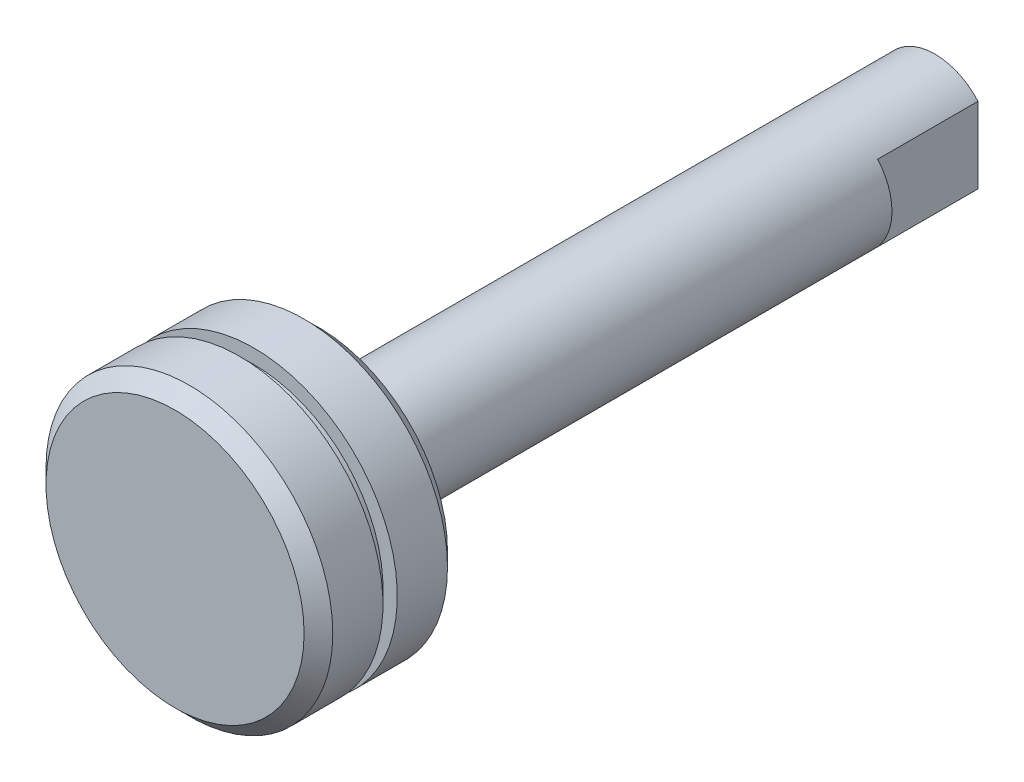
ISO-10303-21;
HEADER;
FILE_DESCRIPTION(('STEP AP214'),'2;1');
FILE_NAME('part.step','',(''),(''),'','','');
FILE_SCHEMA(('AUTOMOTIVE_DESIGN { 1 0 10303 214 1 1 1 1 }'));
ENDSEC;
DATA;
#1=APPLICATION_CONTEXT('core data for automotive mechanical design processes');
#2=APPLICATION_PROTOCOL_DEFINITION('international standard','automotive_design',2000,#1);
#3=PRODUCT_CONTEXT('',#1,'mechanical');
#4=PRODUCT('Part','Part','',(#3));
#5=PRODUCT_RELATED_PRODUCT_CATEGORY('part','',(#4));
#6=PRODUCT_DEFINITION_FORMATION('','',#4);
#7=PRODUCT_DEFINITION_CONTEXT('part definition',#1,'design');
#8=PRODUCT_DEFINITION('design','',#6,#7);
#9=PRODUCT_DEFINITION_SHAPE('','',#8);
#10=(LENGTH_UNIT() NAMED_UNIT(*) SI_UNIT(.MILLI.,.METRE.));
#11=(NAMED_UNIT(*) PLANE_ANGLE_UNIT() SI_UNIT($,.RADIAN.));
#12=(NAMED_UNIT(*) SI_UNIT($,.STERADIAN.) SOLID_ANGLE_UNIT());
#13=UNCERTAINTY_MEASURE_WITH_UNIT(LENGTH_MEASURE(1.E-05),#10,'distance_accuracy_value','');
#14=(GEOMETRIC_REPRESENTATION_CONTEXT(3) GLOBAL_UNCERTAINTY_ASSIGNED_CONTEXT((#13)) GLOBAL_UNIT_ASSIGNED_CONTEXT((#10,
#11,#12)) REPRESENTATION_CONTEXT('',''));
#15=CARTESIAN_POINT('',(0.,0.,0.));
#16=DIRECTION('',(0.,0.,1.));
#17=DIRECTION('',(1.,0.,0.));
#18=AXIS2_PLACEMENT_3D('',#15,#16,#17);
#19=CARTESIAN_POINT('',(0.,0.,43.));
#20=DIRECTION('',(0.,0.,1.));
#21=DIRECTION('',(1.,0.,0.));
#22=AXIS2_PLACEMENT_3D('',#19,#20,#21);
#23=PLANE('',#22);
#24=CARTESIAN_POINT('',(0.,0.,43.));
#25=DIRECTION('',(0.,0.,-1.));
#26=DIRECTION('',(-1.,0.,0.));
#27=AXIS2_PLACEMENT_3D('',#24,#25,#26);
#28=CIRCLE('',#27,7.5);
#29=CARTESIAN_POINT('',(-7.50000000000001,0.,43.));
#30=VERTEX_POINT('',#29);
#31=EDGE_CURVE('E98',#30,#30,#28,.T.);
#32=ORIENTED_EDGE('',*,*,#31,.F.);
#33=EDGE_LOOP('',(#32));
#34=FACE_BOUND('',#33,.T.);
#35=CARTESIAN_POINT('',(0.,0.,43.));
#36=DIRECTION('',(0.,0.,1.));
#37=DIRECTION('',(1.,0.,0.));
#38=AXIS2_PLACEMENT_3D('',#35,#36,#37);
#39=CIRCLE('',#38,9.);
#40=CARTESIAN_POINT('',(9.,0.,43.));
#41=VERTEX_POINT('',#40);
#42=EDGE_CURVE('E11',#41,#41,#39,.F.);
#43=ORIENTED_EDGE('',*,*,#42,.T.);
#44=EDGE_LOOP('',(#43));
#45=FACE_BOUND('',#44,.T.);
#46=ADVANCED_FACE('F36',(#34,#45),#23,.F.);
#47=CARTESIAN_POINT('',(0.,0.,53.));
#48=DIRECTION('',(0.,0.,-1.));
#49=DIRECTION('',(-1.,0.,0.));
#50=AXIS2_PLACEMENT_3D('',#47,#48,#49);
#51=CYLINDRICAL_SURFACE('',#50,10.);
#52=CARTESIAN_POINT('',(0.,0.,47.5));
#53=DIRECTION('',(0.,0.,-1.));
#54=DIRECTION('',(-1.,0.,0.));
#55=AXIS2_PLACEMENT_3D('',#52,#53,#54);
#56=CIRCLE('',#55,10.);
#57=CARTESIAN_POINT('',(-10.,0.,47.5));
#58=VERTEX_POINT('',#57);
#59=EDGE_CURVE('E104',#58,#58,#56,.T.);
#60=ORIENTED_EDGE('',*,*,#59,.T.);
#61=EDGE_LOOP('',(#60));
#62=FACE_BOUND('',#61,.T.);
#63=CARTESIAN_POINT('',(0.,0.,44.));
#64=DIRECTION('',(0.,0.,1.));
#65=DIRECTION('',(1.,0.,0.));
#66=AXIS2_PLACEMENT_3D('',#63,#64,#65);
#67=CIRCLE('',#66,10.);
#68=CARTESIAN_POINT('',(10.,0.,44.));
#69=VERTEX_POINT('',#68);
#70=EDGE_CURVE('E146',#69,#69,#67,.T.);
#71=ORIENTED_EDGE('',*,*,#70,.T.);
#72=EDGE_LOOP('',(#71));
#73=FACE_BOUND('',#72,.T.);
#74=ADVANCED_FACE('F172',(#62,#73),#51,.T.);
#75=CARTESIAN_POINT('',(0.,0.,44.));
#76=DIRECTION('',(0.,0.,1.));
#77=DIRECTION('',(1.,0.,0.));
#78=AXIS2_PLACEMENT_3D('',#75,#76,#77);
#79=CONICAL_SURFACE('',#78,10.,0.785398163397451);
#80=ORIENTED_EDGE('',*,*,#42,.F.);
#81=EDGE_LOOP('',(#80));
#82=FACE_BOUND('',#81,.T.);
#83=ORIENTED_EDGE('',*,*,#70,.F.);
#84=EDGE_LOOP('',(#83));
#85=FACE_BOUND('',#84,.T.);
#86=ADVANCED_FACE('F178',(#82,#85),#79,.T.);
#87=CARTESIAN_POINT('',(0.,10.,48.5));
#88=DIRECTION('',(0.,0.,1.));
#89=DIRECTION('',(1.,0.,0.));
#90=AXIS2_PLACEMENT_3D('',#87,#88,#89);
#91=PLANE('',#90);
#92=CARTESIAN_POINT('',(0.,0.,48.5));
#93=DIRECTION('',(0.,0.,-1.));
#94=DIRECTION('',(-1.,0.,0.));
#95=AXIS2_PLACEMENT_3D('',#92,#93,#94);
#96=CIRCLE('',#95,9.);
#97=CARTESIAN_POINT('',(-9.,0.,48.5));
#98=VERTEX_POINT('',#97);
#99=EDGE_CURVE('E110',#98,#98,#96,.T.);
#100=ORIENTED_EDGE('',*,*,#99,.F.);
#101=EDGE_LOOP('',(#100));
#102=FACE_BOUND('',#101,.T.);
#103=CARTESIAN_POINT('',(0.,0.,48.5));
#104=DIRECTION('',(0.,0.,-1.));
#105=DIRECTION('',(-1.,0.,0.));
#106=AXIS2_PLACEMENT_3D('',#103,#104,#105);
#107=CIRCLE('',#106,10.);
#108=CARTESIAN_POINT('',(-10.,0.,48.5));
#109=VERTEX_POINT('',#108);
#110=EDGE_CURVE('E95',#109,#109,#107,.T.);
#111=ORIENTED_EDGE('',*,*,#110,.T.);
#112=EDGE_LOOP('',(#111));
#113=FACE_BOUND('',#112,.T.);
#114=ADVANCED_FACE('F222',(#102,#113),#91,.F.);
#115=CARTESIAN_POINT('',(0.,0.,53.));
#116=DIRECTION('',(0.,0.,-1.));
#117=DIRECTION('',(-1.,0.,0.));
#118=AXIS2_PLACEMENT_3D('',#115,#116,#117);
#119=CYLINDRICAL_SURFACE('',#118,9.);
#120=CARTESIAN_POINT('',(0.,0.,47.5));
#121=DIRECTION('',(0.,0.,-1.));
#122=DIRECTION('',(-1.,0.,0.));
#123=AXIS2_PLACEMENT_3D('',#120,#121,#122);
#124=CIRCLE('',#123,9.);
#125=CARTESIAN_POINT('',(-9.,0.,47.5));
#126=VERTEX_POINT('',#125);
#127=EDGE_CURVE('E107',#126,#126,#124,.T.);
#128=ORIENTED_EDGE('',*,*,#127,.F.);
#129=EDGE_LOOP('',(#128));
#130=FACE_BOUND('',#129,.T.);
#131=ORIENTED_EDGE('',*,*,#99,.T.);
#132=EDGE_LOOP('',(#131));
#133=FACE_BOUND('',#132,.T.);
#134=ADVANCED_FACE('F166',(#130,#133),#119,.T.);
#135=CARTESIAN_POINT('',(0.,10.,47.5));
#136=DIRECTION('',(0.,0.,-1.));
#137=DIRECTION('',(-1.,0.,0.));
#138=AXIS2_PLACEMENT_3D('',#135,#136,#137);
#139=PLANE('',#138);
#140=ORIENTED_EDGE('',*,*,#59,.F.);
#141=EDGE_LOOP('',(#140));
#142=FACE_BOUND('',#141,.T.);
#143=ORIENTED_EDGE('',*,*,#127,.T.);
#144=EDGE_LOOP('',(#143));
#145=FACE_BOUND('',#144,.T.);
#146=ADVANCED_FACE('F161',(#142,#145),#139,.F.);
#147=CARTESIAN_POINT('',(0.,0.,53.));
#148=DIRECTION('',(0.,0.,1.));
#149=DIRECTION('',(1.,0.,0.));
#150=AXIS2_PLACEMENT_3D('',#147,#148,#149);
#151=PLANE('',#150);
#152=CARTESIAN_POINT('',(0.,0.,53.));
#153=DIRECTION('',(0.,0.,1.));
#154=DIRECTION('',(1.,0.,0.));
#155=AXIS2_PLACEMENT_3D('',#152,#153,#154);
#156=CIRCLE('',#155,9.);
#157=CARTESIAN_POINT('',(9.,0.,53.));
#158=VERTEX_POINT('',#157);
#159=EDGE_CURVE('E143',#158,#158,#156,.T.);
#160=ORIENTED_EDGE('',*,*,#159,.T.);
#161=EDGE_LOOP('',(#160));
#162=FACE_BOUND('',#161,.T.);
#163=ADVANCED_FACE('F156',(#162),#151,.T.);
#164=CARTESIAN_POINT('',(0.,0.,53.));
#165=DIRECTION('',(0.,0.,-1.));
#166=DIRECTION('',(-1.,0.,0.));
#167=AXIS2_PLACEMENT_3D('',#164,#165,#166);
#168=CONICAL_SURFACE('',#167,9.,0.785398163397444);
#169=CARTESIAN_POINT('',(0.,0.,52.));
#170=DIRECTION('',(0.,0.,1.));
#171=DIRECTION('',(1.,0.,0.));
#172=AXIS2_PLACEMENT_3D('',#169,#170,#171);
#173=CIRCLE('',#172,10.);
#174=CARTESIAN_POINT('',(10.,0.,52.));
#175=VERTEX_POINT('',#174);
#176=EDGE_CURVE('E44',#175,#175,#173,.F.);
#177=ORIENTED_EDGE('',*,*,#176,.F.);
#178=EDGE_LOOP('',(#177));
#179=FACE_BOUND('',#178,.T.);
#180=ORIENTED_EDGE('',*,*,#159,.F.);
#181=EDGE_LOOP('',(#180));
#182=FACE_BOUND('',#181,.T.);
#183=ADVANCED_FACE('F153',(#179,#182),#168,.T.);
#184=ORIENTED_EDGE('',*,*,#110,.F.);
#185=EDGE_LOOP('',(#184));
#186=FACE_BOUND('',#185,.T.);
#187=ORIENTED_EDGE('',*,*,#176,.T.);
#188=EDGE_LOOP('',(#187));
#189=FACE_BOUND('',#188,.T.);
#190=ADVANCED_FACE('F151',(#186,#189),#51,.T.);
#191=CARTESIAN_POINT('',(0.,0.,45.));
#192=DIRECTION('',(0.,0.,-1.));
#193=DIRECTION('',(-1.,0.,0.));
#194=AXIS2_PLACEMENT_3D('',#191,#192,#193);
#195=CYLINDRICAL_SURFACE('',#194,7.5);
#196=CARTESIAN_POINT('',(0.,0.,45.));
#197=DIRECTION('',(0.,0.,-1.));
#198=DIRECTION('',(-1.,0.,0.));
#199=AXIS2_PLACEMENT_3D('',#196,#197,#198);
#200=CIRCLE('',#199,7.5);
#201=CARTESIAN_POINT('',(-7.50000000000001,0.,45.));
#202=VERTEX_POINT('',#201);
#203=EDGE_CURVE('E92',#202,#202,#200,.T.);
#204=ORIENTED_EDGE('',*,*,#203,.F.);
#205=EDGE_LOOP('',(#204));
#206=FACE_BOUND('',#205,.T.);
#207=ORIENTED_EDGE('',*,*,#31,.T.);
#208=EDGE_LOOP('',(#207));
#209=FACE_BOUND('',#208,.T.);
#210=ADVANCED_FACE('F202',(#206,#209),#195,.F.);
#211=CARTESIAN_POINT('',(0.,0.,45.));
#212=DIRECTION('',(0.,0.,-1.));
#213=DIRECTION('',(-1.,0.,0.));
#214=AXIS2_PLACEMENT_3D('',#211,#212,#213);
#215=PLANE('',#214);
#216=CARTESIAN_POINT('',(0.,0.,45.));
#217=DIRECTION('',(0.,0.,-1.));
#218=DIRECTION('',(-1.,0.,0.));
#219=AXIS2_PLACEMENT_3D('',#216,#217,#218);
#220=CIRCLE('',#219,6.5);
#221=CARTESIAN_POINT('',(-6.50000000000001,0.,45.));
#222=VERTEX_POINT('',#221);
#223=EDGE_CURVE('E196',#222,#222,#220,.T.);
#224=ORIENTED_EDGE('',*,*,#223,.F.);
#225=EDGE_LOOP('',(#224));
#226=FACE_BOUND('',#225,.T.);
#227=ORIENTED_EDGE('',*,*,#203,.T.);
#228=EDGE_LOOP('',(#227));
#229=FACE_BOUND('',#228,.T.);
#230=ADVANCED_FACE('F204',(#226,#229),#215,.T.);
#231=CARTESIAN_POINT('',(0.,0.,45.));
#232=DIRECTION('',(0.,0.,-1.));
#233=DIRECTION('',(-1.,0.,0.));
#234=AXIS2_PLACEMENT_3D('',#231,#232,#233);
#235=CYLINDRICAL_SURFACE('',#234,6.5);
#236=ORIENTED_EDGE('',*,*,#223,.T.);
#237=EDGE_LOOP('',(#236));
#238=FACE_BOUND('',#237,.T.);
#239=CARTESIAN_POINT('',(0.,0.,43.));
#240=DIRECTION('',(0.,0.,-1.));
#241=DIRECTION('',(-1.,0.,0.));
#242=AXIS2_PLACEMENT_3D('',#239,#240,#241);
#243=CIRCLE('',#242,6.5);
#244=CARTESIAN_POINT('',(-6.50000000000001,0.,43.));
#245=VERTEX_POINT('',#244);
#246=EDGE_CURVE('E194',#245,#245,#243,.T.);
#247=ORIENTED_EDGE('',*,*,#246,.F.);
#248=EDGE_LOOP('',(#247));
#249=FACE_BOUND('',#248,.T.);
#250=ADVANCED_FACE('F85',(#238,#249),#235,.T.);
#251=CARTESIAN_POINT('',(0.,0.,19.));
#252=DIRECTION('',(0.,0.,-1.));
#253=DIRECTION('',(-1.,0.,0.));
#254=AXIS2_PLACEMENT_3D('',#251,#252,#253);
#255=CONICAL_SURFACE('',#254,2.1,1.02974425867665);
#256=CARTESIAN_POINT('',(0.,0.,20.2618072999579));
#257=VERTEX_POINT('',#256);
#258=VERTEX_LOOP('',#257);
#259=FACE_BOUND('',#258,.T.);
#260=CARTESIAN_POINT('',(0.,0.,19.));
#261=DIRECTION('',(0.,0.,-1.));
#262=DIRECTION('',(-1.,0.,0.));
#263=AXIS2_PLACEMENT_3D('',#260,#261,#262);
#264=CIRCLE('',#263,2.1);
#265=CARTESIAN_POINT('',(-2.1,0.,19.));
#266=VERTEX_POINT('',#265);
#267=EDGE_CURVE('E89',#266,#266,#264,.T.);
#268=ORIENTED_EDGE('',*,*,#267,.T.);
#269=EDGE_LOOP('',(#268));
#270=FACE_BOUND('',#269,.T.);
#271=ADVANCED_FACE('F81',(#259,#270),#255,.F.);
#272=CARTESIAN_POINT('',(0.,0.,0.));
#273=DIRECTION('',(0.,0.,-1.));
#274=DIRECTION('',(-1.,0.,0.));
#275=AXIS2_PLACEMENT_3D('',#272,#273,#274);
#276=CYLINDRICAL_SURFACE('',#275,2.1);
#277=ORIENTED_EDGE('',*,*,#267,.F.);
#278=EDGE_LOOP('',(#277));
#279=FACE_BOUND('',#278,.T.);
#280=CARTESIAN_POINT('',(0.,0.,0.));
#281=DIRECTION('',(0.,0.,-1.));
#282=DIRECTION('',(-1.,0.,0.));
#283=AXIS2_PLACEMENT_3D('',#280,#281,#282);
#284=CIRCLE('',#283,2.1);
#285=CARTESIAN_POINT('',(-2.1,0.,0.));
#286=VERTEX_POINT('',#285);
#287=EDGE_CURVE('E91',#286,#286,#284,.T.);
#288=ORIENTED_EDGE('',*,*,#287,.T.);
#289=EDGE_LOOP('',(#288));
#290=FACE_BOUND('',#289,.T.);
#291=ADVANCED_FACE('F84',(#279,#290),#276,.F.);
#292=CARTESIAN_POINT('',(-3.,-3.90950226244325,7.));
#293=DIRECTION('',(0.,0.,-1.));
#294=DIRECTION('',(-1.,0.,0.));
#295=AXIS2_PLACEMENT_3D('',#292,#293,#294);
#296=PLANE('',#295);
#297=CARTESIAN_POINT('',(0.,0.,7.));
#298=DIRECTION('',(0.,0.,-1.));
#299=DIRECTION('',(-1.,0.,0.));
#300=AXIS2_PLACEMENT_3D('',#297,#298,#299);
#301=CIRCLE('',#300,4.);
#302=CARTESIAN_POINT('',(-3.,-2.64575131106459,7.));
#303=VERTEX_POINT('',#302);
#304=CARTESIAN_POINT('',(-3.,2.64575131106459,7.));
#305=VERTEX_POINT('',#304);
#306=EDGE_CURVE('E136',#303,#305,#301,.T.);
#307=ORIENTED_EDGE('',*,*,#306,.T.);
#308=DIRECTION('',(0.,-1.,0.));
#309=VECTOR('',#308,1.);
#310=CARTESIAN_POINT('',(-3.,4.10256410256429,7.));
#311=LINE('',#310,#309);
#312=EDGE_CURVE('E119',#305,#303,#311,.T.);
#313=ORIENTED_EDGE('',*,*,#312,.T.);
#314=EDGE_LOOP('',(#307,#313));
#315=FACE_BOUND('',#314,.T.);
#316=ADVANCED_FACE('F218',(#315),#296,.T.);
#317=CARTESIAN_POINT('',(-3.,4.10256410256429,7.));
#318=DIRECTION('',(1.,0.,0.));
#319=DIRECTION('',(0.,1.,0.));
#320=AXIS2_PLACEMENT_3D('',#317,#318,#319);
#321=PLANE('',#320);
#322=ORIENTED_EDGE('',*,*,#312,.F.);
#323=DIRECTION('',(0.,0.,-1.));
#324=VECTOR('',#323,1.);
#325=CARTESIAN_POINT('',(-3.,2.64575131106459,43.));
#326=LINE('',#325,#324);
#327=CARTESIAN_POINT('',(-3.,2.64575131106459,0.));
#328=VERTEX_POINT('',#327);
#329=EDGE_CURVE('E122',#328,#305,#326,.F.);
#330=ORIENTED_EDGE('',*,*,#329,.F.);
#331=DIRECTION('',(0.,1.,0.));
#332=VECTOR('',#331,1.);
#333=CARTESIAN_POINT('',(-3.,0.,0.));
#334=LINE('',#333,#332);
#335=CARTESIAN_POINT('',(-3.,-2.64575131106459,0.));
#336=VERTEX_POINT('',#335);
#337=EDGE_CURVE('E133',#336,#328,#334,.T.);
#338=ORIENTED_EDGE('',*,*,#337,.F.);
#339=DIRECTION('',(0.,0.,-1.));
#340=VECTOR('',#339,1.);
#341=CARTESIAN_POINT('',(-3.,-2.64575131106459,43.));
#342=LINE('',#341,#340);
#343=EDGE_CURVE('E124',#303,#336,#342,.T.);
#344=ORIENTED_EDGE('',*,*,#343,.F.);
#345=EDGE_LOOP('',(#322,#330,#338,#344));
#346=FACE_BOUND('',#345,.T.);
#347=ADVANCED_FACE('F238',(#346),#321,.F.);
#348=CARTESIAN_POINT('',(0.,0.,0.));
#349=DIRECTION('',(0.,0.,1.));
#350=DIRECTION('',(1.,0.,0.));
#351=AXIS2_PLACEMENT_3D('',#348,#349,#350);
#352=PLANE('',#351);
#353=ORIENTED_EDGE('',*,*,#287,.F.);
#354=EDGE_LOOP('',(#353));
#355=FACE_BOUND('',#354,.T.);
#356=CARTESIAN_POINT('',(0.,0.,0.));
#357=DIRECTION('',(0.,0.,1.));
#358=DIRECTION('',(1.,0.,0.));
#359=AXIS2_PLACEMENT_3D('',#356,#357,#358);
#360=CIRCLE('',#359,4.);
#361=CARTESIAN_POINT('',(3.,2.64575131106459,0.));
#362=VERTEX_POINT('',#361);
#363=EDGE_CURVE('E59',#362,#328,#360,.T.);
#364=ORIENTED_EDGE('',*,*,#363,.F.);
#365=DIRECTION('',(0.,-1.,0.));
#366=VECTOR('',#365,1.);
#367=CARTESIAN_POINT('',(3.,0.,0.));
#368=LINE('',#367,#366);
#369=CARTESIAN_POINT('',(3.,-2.64575131106459,0.));
#370=VERTEX_POINT('',#369);
#371=EDGE_CURVE('E138',#362,#370,#368,.T.);
#372=ORIENTED_EDGE('',*,*,#371,.T.);
#373=EDGE_CURVE('E127',#336,#370,#360,.T.);
#374=ORIENTED_EDGE('',*,*,#373,.F.);
#375=ORIENTED_EDGE('',*,*,#337,.T.);
#376=EDGE_LOOP('',(#364,#372,#374,#375));
#377=FACE_BOUND('',#376,.T.);
#378=ADVANCED_FACE('F236',(#355,#377),#352,.F.);
#379=CARTESIAN_POINT('',(3.,4.10256410256429,7.));
#380=DIRECTION('',(-1.,0.,0.));
#381=DIRECTION('',(0.,-1.,0.));
#382=AXIS2_PLACEMENT_3D('',#379,#380,#381);
#383=PLANE('',#382);
#384=DIRECTION('',(0.,1.,0.));
#385=VECTOR('',#384,1.);
#386=CARTESIAN_POINT('',(3.,4.10256410256429,7.));
#387=LINE('',#386,#385);
#388=CARTESIAN_POINT('',(3.,-2.64575131106459,7.));
#389=VERTEX_POINT('',#388);
#390=CARTESIAN_POINT('',(3.,2.64575131106459,7.));
#391=VERTEX_POINT('',#390);
#392=EDGE_CURVE('E113',#389,#391,#387,.T.);
#393=ORIENTED_EDGE('',*,*,#392,.F.);
#394=DIRECTION('',(0.,0.,-1.));
#395=VECTOR('',#394,1.);
#396=CARTESIAN_POINT('',(3.,-2.64575131106459,43.));
#397=LINE('',#396,#395);
#398=EDGE_CURVE('E51',#370,#389,#397,.F.);
#399=ORIENTED_EDGE('',*,*,#398,.F.);
#400=ORIENTED_EDGE('',*,*,#371,.F.);
#401=DIRECTION('',(0.,0.,-1.));
#402=VECTOR('',#401,1.);
#403=CARTESIAN_POINT('',(3.,2.64575131106459,43.));
#404=LINE('',#403,#402);
#405=EDGE_CURVE('E117',#391,#362,#404,.T.);
#406=ORIENTED_EDGE('',*,*,#405,.F.);
#407=EDGE_LOOP('',(#393,#399,#400,#406));
#408=FACE_BOUND('',#407,.T.);
#409=ADVANCED_FACE('F232',(#408),#383,.F.);
#410=CARTESIAN_POINT('',(3.,-4.16691804927081,7.));
#411=DIRECTION('',(0.,0.,1.));
#412=DIRECTION('',(1.,0.,0.));
#413=AXIS2_PLACEMENT_3D('',#410,#411,#412);
#414=PLANE('',#413);
#415=ORIENTED_EDGE('',*,*,#392,.T.);
#416=CARTESIAN_POINT('',(0.,0.,7.));
#417=DIRECTION('',(0.,0.,1.));
#418=DIRECTION('',(1.,0.,0.));
#419=AXIS2_PLACEMENT_3D('',#416,#417,#418);
#420=CIRCLE('',#419,4.);
#421=EDGE_CURVE('E140',#389,#391,#420,.T.);
#422=ORIENTED_EDGE('',*,*,#421,.F.);
#423=EDGE_LOOP('',(#415,#422));
#424=FACE_BOUND('',#423,.T.);
#425=ADVANCED_FACE('F188',(#424),#414,.F.);
#426=CARTESIAN_POINT('',(0.,0.,43.));
#427=DIRECTION('',(0.,0.,-1.));
#428=DIRECTION('',(-1.,0.,0.));
#429=AXIS2_PLACEMENT_3D('',#426,#427,#428);
#430=CYLINDRICAL_SURFACE('',#429,4.);
#431=CARTESIAN_POINT('',(0.,0.,43.));
#432=DIRECTION('',(0.,0.,1.));
#433=DIRECTION('',(1.,0.,0.));
#434=AXIS2_PLACEMENT_3D('',#431,#432,#433);
#435=CIRCLE('',#434,4.);
#436=CARTESIAN_POINT('',(4.,0.,43.));
#437=VERTEX_POINT('',#436);
#438=EDGE_CURVE('E130',#437,#437,#435,.T.);
#439=ORIENTED_EDGE('',*,*,#438,.F.);
#440=EDGE_LOOP('',(#439));
#441=FACE_BOUND('',#440,.T.);
#442=ORIENTED_EDGE('',*,*,#421,.T.);
#443=ORIENTED_EDGE('',*,*,#405,.T.);
#444=ORIENTED_EDGE('',*,*,#363,.T.);
#445=ORIENTED_EDGE('',*,*,#329,.T.);
#446=ORIENTED_EDGE('',*,*,#306,.F.);
#447=ORIENTED_EDGE('',*,*,#343,.T.);
#448=ORIENTED_EDGE('',*,*,#373,.T.);
#449=ORIENTED_EDGE('',*,*,#398,.T.);
#450=EDGE_LOOP('',(#442,#443,#444,#445,#446,#447,#448,#449));
#451=FACE_BOUND('',#450,.T.);
#452=ADVANCED_FACE('F38',(#441,#451),#430,.T.);
#453=ORIENTED_EDGE('',*,*,#438,.T.);
#454=EDGE_LOOP('',(#453));
#455=FACE_BOUND('',#454,.T.);
#456=ORIENTED_EDGE('',*,*,#246,.T.);
#457=EDGE_LOOP('',(#456));
#458=FACE_BOUND('',#457,.T.);
#459=ADVANCED_FACE('F174',(#455,#458),#23,.F.);
#460=CLOSED_SHELL('',(#46,#74,#86,#114,#134,#146,#163,#183,#190,#210,#230,#250,#271,#291,#316,
#347,#378,#409,#425,#452,#459));
#461=MANIFOLD_SOLID_BREP('B2',#460);
#462=ADVANCED_BREP_SHAPE_REPRESENTATION('',(#18,#461),#14);
#463=SHAPE_DEFINITION_REPRESENTATION(#9,#462);
ENDSEC;
END-ISO-10303-21;
